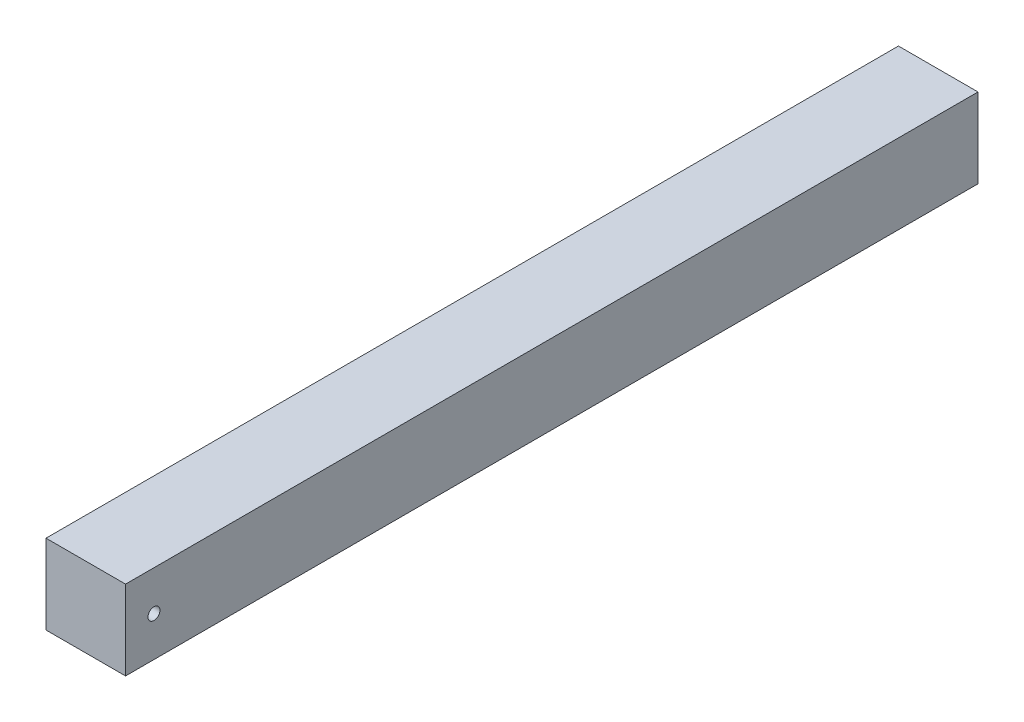
ISO-10303-21;
HEADER;
FILE_DESCRIPTION(('STEP AP214'),'2;1');
FILE_NAME('part.step','',(''),(''),'','','');
FILE_SCHEMA(('AUTOMOTIVE_DESIGN { 1 0 10303 214 1 1 1 1 }'));
ENDSEC;
DATA;
#1=APPLICATION_CONTEXT('core data for automotive mechanical design processes');
#2=APPLICATION_PROTOCOL_DEFINITION('international standard','automotive_design',2000,#1);
#3=PRODUCT_CONTEXT('',#1,'mechanical');
#4=PRODUCT('Part','Part','',(#3));
#5=PRODUCT_RELATED_PRODUCT_CATEGORY('part','',(#4));
#6=PRODUCT_DEFINITION_FORMATION('','',#4);
#7=PRODUCT_DEFINITION_CONTEXT('part definition',#1,'design');
#8=PRODUCT_DEFINITION('design','',#6,#7);
#9=PRODUCT_DEFINITION_SHAPE('','',#8);
#10=(LENGTH_UNIT() NAMED_UNIT(*) SI_UNIT(.MILLI.,.METRE.));
#11=(NAMED_UNIT(*) PLANE_ANGLE_UNIT() SI_UNIT($,.RADIAN.));
#12=(NAMED_UNIT(*) SI_UNIT($,.STERADIAN.) SOLID_ANGLE_UNIT());
#13=UNCERTAINTY_MEASURE_WITH_UNIT(LENGTH_MEASURE(1.E-05),#10,'distance_accuracy_value','');
#14=(GEOMETRIC_REPRESENTATION_CONTEXT(3) GLOBAL_UNCERTAINTY_ASSIGNED_CONTEXT((#13)) GLOBAL_UNIT_ASSIGNED_CONTEXT((#10,
#11,#12)) REPRESENTATION_CONTEXT('',''));
#15=CARTESIAN_POINT('',(0.,0.,0.));
#16=DIRECTION('',(0.,0.,1.));
#17=DIRECTION('',(1.,0.,0.));
#18=AXIS2_PLACEMENT_3D('',#15,#16,#17);
#19=CARTESIAN_POINT('',(7.,7.,150.));
#20=DIRECTION('',(-1.,0.,0.));
#21=DIRECTION('',(0.,-1.,0.));
#22=AXIS2_PLACEMENT_3D('',#19,#20,#21);
#23=PLANE('',#22);
#24=CARTESIAN_POINT('',(7.,0.,145.));
#25=DIRECTION('',(1.,0.,0.));
#26=DIRECTION('',(0.,0.,-1.));
#27=AXIS2_PLACEMENT_3D('',#24,#25,#26);
#28=CIRCLE('',#27,1.04999999999999);
#29=CARTESIAN_POINT('',(7.,0.,143.95));
#30=VERTEX_POINT('',#29);
#31=EDGE_CURVE('E116',#30,#30,#28,.T.);
#32=ORIENTED_EDGE('',*,*,#31,.F.);
#33=EDGE_LOOP('',(#32));
#34=FACE_BOUND('',#33,.T.);
#35=DIRECTION('',(0.,1.,0.));
#36=VECTOR('',#35,1.);
#37=CARTESIAN_POINT('',(7.,7.,0.));
#38=LINE('',#37,#36);
#39=CARTESIAN_POINT('',(7.,-7.,0.));
#40=VERTEX_POINT('',#39);
#41=CARTESIAN_POINT('',(7.,7.,0.));
#42=VERTEX_POINT('',#41);
#43=EDGE_CURVE('E100',#40,#42,#38,.T.);
#44=ORIENTED_EDGE('',*,*,#43,.T.);
#45=DIRECTION('',(0.,0.,-1.));
#46=VECTOR('',#45,1.);
#47=CARTESIAN_POINT('',(7.,7.,150.));
#48=LINE('',#47,#46);
#49=CARTESIAN_POINT('',(7.,7.,150.));
#50=VERTEX_POINT('',#49);
#51=EDGE_CURVE('E11',#50,#42,#48,.T.);
#52=ORIENTED_EDGE('',*,*,#51,.F.);
#53=DIRECTION('',(0.,1.,0.));
#54=VECTOR('',#53,1.);
#55=CARTESIAN_POINT('',(7.,7.,150.));
#56=LINE('',#55,#54);
#57=CARTESIAN_POINT('',(7.,-7.,150.));
#58=VERTEX_POINT('',#57);
#59=EDGE_CURVE('E88',#58,#50,#56,.T.);
#60=ORIENTED_EDGE('',*,*,#59,.F.);
#61=DIRECTION('',(0.,0.,-1.));
#62=VECTOR('',#61,1.);
#63=CARTESIAN_POINT('',(7.,-7.,150.));
#64=LINE('',#63,#62);
#65=EDGE_CURVE('E96',#58,#40,#64,.T.);
#66=ORIENTED_EDGE('',*,*,#65,.T.);
#67=EDGE_LOOP('',(#44,#52,#60,#66));
#68=FACE_BOUND('',#67,.T.);
#69=ADVANCED_FACE('F37',(#34,#68),#23,.F.);
#70=CARTESIAN_POINT('',(-7.,7.,150.));
#71=DIRECTION('',(0.,-1.,0.));
#72=DIRECTION('',(0.,0.,-1.));
#73=AXIS2_PLACEMENT_3D('',#70,#71,#72);
#74=PLANE('',#73);
#75=DIRECTION('',(-1.,0.,0.));
#76=VECTOR('',#75,1.);
#77=CARTESIAN_POINT('',(-7.,7.,0.));
#78=LINE('',#77,#76);
#79=CARTESIAN_POINT('',(-7.,7.,0.));
#80=VERTEX_POINT('',#79);
#81=EDGE_CURVE('E92',#42,#80,#78,.T.);
#82=ORIENTED_EDGE('',*,*,#81,.T.);
#83=DIRECTION('',(0.,0.,-1.));
#84=VECTOR('',#83,1.);
#85=CARTESIAN_POINT('',(-7.,7.,150.));
#86=LINE('',#85,#84);
#87=CARTESIAN_POINT('',(-7.,7.,150.));
#88=VERTEX_POINT('',#87);
#89=EDGE_CURVE('E45',#88,#80,#86,.T.);
#90=ORIENTED_EDGE('',*,*,#89,.F.);
#91=DIRECTION('',(-1.,0.,0.));
#92=VECTOR('',#91,1.);
#93=CARTESIAN_POINT('',(-7.,7.,150.));
#94=LINE('',#93,#92);
#95=EDGE_CURVE('E83',#50,#88,#94,.T.);
#96=ORIENTED_EDGE('',*,*,#95,.F.);
#97=ORIENTED_EDGE('',*,*,#51,.T.);
#98=EDGE_LOOP('',(#82,#90,#96,#97));
#99=FACE_BOUND('',#98,.T.);
#100=ADVANCED_FACE('F91',(#99),#74,.F.);
#101=CARTESIAN_POINT('',(-7.,7.,150.));
#102=DIRECTION('',(1.,0.,0.));
#103=DIRECTION('',(0.,1.,0.));
#104=AXIS2_PLACEMENT_3D('',#101,#102,#103);
#105=PLANE('',#104);
#106=CARTESIAN_POINT('',(-7.,0.,145.));
#107=DIRECTION('',(1.,0.,0.));
#108=DIRECTION('',(0.,0.,-1.));
#109=AXIS2_PLACEMENT_3D('',#106,#107,#108);
#110=CIRCLE('',#109,1.04999999999999);
#111=CARTESIAN_POINT('',(-7.,0.,143.95));
#112=VERTEX_POINT('',#111);
#113=EDGE_CURVE('E103',#112,#112,#110,.T.);
#114=ORIENTED_EDGE('',*,*,#113,.T.);
#115=EDGE_LOOP('',(#114));
#116=FACE_BOUND('',#115,.T.);
#117=DIRECTION('',(0.,-1.,0.));
#118=VECTOR('',#117,1.);
#119=CARTESIAN_POINT('',(-7.,7.,0.));
#120=LINE('',#119,#118);
#121=CARTESIAN_POINT('',(-7.,-7.,0.));
#122=VERTEX_POINT('',#121);
#123=EDGE_CURVE('E70',#80,#122,#120,.T.);
#124=ORIENTED_EDGE('',*,*,#123,.T.);
#125=DIRECTION('',(0.,0.,-1.));
#126=VECTOR('',#125,1.);
#127=CARTESIAN_POINT('',(-7.,-7.,150.));
#128=LINE('',#127,#126);
#129=CARTESIAN_POINT('',(-7.,-7.,150.));
#130=VERTEX_POINT('',#129);
#131=EDGE_CURVE('E93',#130,#122,#128,.T.);
#132=ORIENTED_EDGE('',*,*,#131,.F.);
#133=DIRECTION('',(0.,-1.,0.));
#134=VECTOR('',#133,1.);
#135=CARTESIAN_POINT('',(-7.,7.,150.));
#136=LINE('',#135,#134);
#137=EDGE_CURVE('E86',#88,#130,#136,.T.);
#138=ORIENTED_EDGE('',*,*,#137,.F.);
#139=ORIENTED_EDGE('',*,*,#89,.T.);
#140=EDGE_LOOP('',(#124,#132,#138,#139));
#141=FACE_BOUND('',#140,.T.);
#142=ADVANCED_FACE('F94',(#116,#141),#105,.F.);
#143=CARTESIAN_POINT('',(-7.,-7.,150.));
#144=DIRECTION('',(0.,1.,0.));
#145=DIRECTION('',(0.,0.,1.));
#146=AXIS2_PLACEMENT_3D('',#143,#144,#145);
#147=PLANE('',#146);
#148=DIRECTION('',(1.,0.,0.));
#149=VECTOR('',#148,1.);
#150=CARTESIAN_POINT('',(-7.,-7.,0.));
#151=LINE('',#150,#149);
#152=EDGE_CURVE('E76',#122,#40,#151,.T.);
#153=ORIENTED_EDGE('',*,*,#152,.T.);
#154=ORIENTED_EDGE('',*,*,#65,.F.);
#155=DIRECTION('',(1.,0.,0.));
#156=VECTOR('',#155,1.);
#157=CARTESIAN_POINT('',(-7.,-7.,150.));
#158=LINE('',#157,#156);
#159=EDGE_CURVE('E53',#130,#58,#158,.T.);
#160=ORIENTED_EDGE('',*,*,#159,.F.);
#161=ORIENTED_EDGE('',*,*,#131,.T.);
#162=EDGE_LOOP('',(#153,#154,#160,#161));
#163=FACE_BOUND('',#162,.T.);
#164=ADVANCED_FACE('F108',(#163),#147,.F.);
#165=CARTESIAN_POINT('',(0.,0.,150.));
#166=DIRECTION('',(0.,0.,1.));
#167=DIRECTION('',(1.,0.,0.));
#168=AXIS2_PLACEMENT_3D('',#165,#166,#167);
#169=PLANE('',#168);
#170=ORIENTED_EDGE('',*,*,#59,.T.);
#171=ORIENTED_EDGE('',*,*,#95,.T.);
#172=ORIENTED_EDGE('',*,*,#137,.T.);
#173=ORIENTED_EDGE('',*,*,#159,.T.);
#174=EDGE_LOOP('',(#170,#171,#172,#173));
#175=FACE_BOUND('',#174,.T.);
#176=ADVANCED_FACE('F84',(#175),#169,.T.);
#177=CARTESIAN_POINT('',(0.,0.,0.));
#178=DIRECTION('',(0.,0.,1.));
#179=DIRECTION('',(1.,0.,0.));
#180=AXIS2_PLACEMENT_3D('',#177,#178,#179);
#181=PLANE('',#180);
#182=ORIENTED_EDGE('',*,*,#43,.F.);
#183=ORIENTED_EDGE('',*,*,#152,.F.);
#184=ORIENTED_EDGE('',*,*,#123,.F.);
#185=ORIENTED_EDGE('',*,*,#81,.F.);
#186=EDGE_LOOP('',(#182,#183,#184,#185));
#187=FACE_BOUND('',#186,.T.);
#188=ADVANCED_FACE('F111',(#187),#181,.F.);
#189=CARTESIAN_POINT('',(-7.,0.,145.));
#190=DIRECTION('',(1.,0.,0.));
#191=DIRECTION('',(0.,0.,-1.));
#192=AXIS2_PLACEMENT_3D('',#189,#190,#191);
#193=CYLINDRICAL_SURFACE('',#192,1.04999999999999);
#194=ORIENTED_EDGE('',*,*,#113,.F.);
#195=EDGE_LOOP('',(#194));
#196=FACE_BOUND('',#195,.T.);
#197=ORIENTED_EDGE('',*,*,#31,.T.);
#198=EDGE_LOOP('',(#197));
#199=FACE_BOUND('',#198,.T.);
#200=ADVANCED_FACE('F120',(#196,#199),#193,.F.);
#201=CLOSED_SHELL('',(#69,#100,#142,#164,#176,#188,#200));
#202=MANIFOLD_SOLID_BREP('B2',#201);
#203=ADVANCED_BREP_SHAPE_REPRESENTATION('',(#18,#202),#14);
#204=SHAPE_DEFINITION_REPRESENTATION(#9,#203);
ENDSEC;
END-ISO-10303-21;
